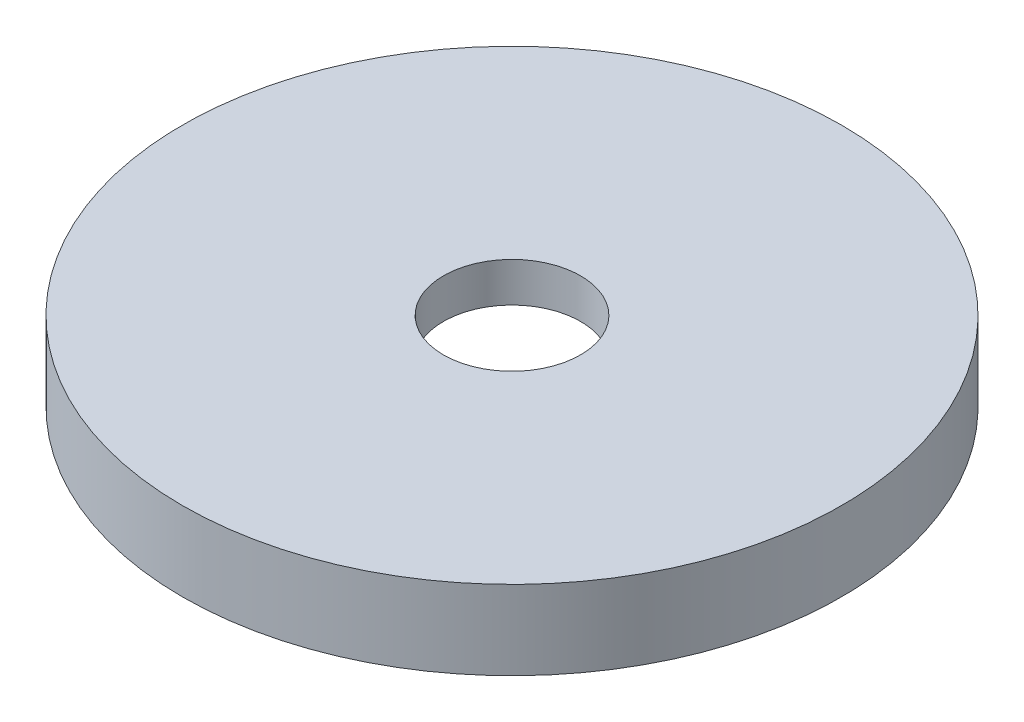
ISO-10303-21;
HEADER;
FILE_DESCRIPTION(('STEP AP214'),'2;1');
FILE_NAME('part.step','',(''),(''),'','','');
FILE_SCHEMA(('AUTOMOTIVE_DESIGN { 1 0 10303 214 1 1 1 1 }'));
ENDSEC;
DATA;
#1=APPLICATION_CONTEXT('core data for automotive mechanical design processes');
#2=APPLICATION_PROTOCOL_DEFINITION('international standard','automotive_design',2000,#1);
#3=PRODUCT_CONTEXT('',#1,'mechanical');
#4=PRODUCT('Part','Part','',(#3));
#5=PRODUCT_RELATED_PRODUCT_CATEGORY('part','',(#4));
#6=PRODUCT_DEFINITION_FORMATION('','',#4);
#7=PRODUCT_DEFINITION_CONTEXT('part definition',#1,'design');
#8=PRODUCT_DEFINITION('design','',#6,#7);
#9=PRODUCT_DEFINITION_SHAPE('','',#8);
#10=(LENGTH_UNIT() NAMED_UNIT(*) SI_UNIT(.MILLI.,.METRE.));
#11=(NAMED_UNIT(*) PLANE_ANGLE_UNIT() SI_UNIT($,.RADIAN.));
#12=(NAMED_UNIT(*) SI_UNIT($,.STERADIAN.) SOLID_ANGLE_UNIT());
#13=UNCERTAINTY_MEASURE_WITH_UNIT(LENGTH_MEASURE(1.E-05),#10,'distance_accuracy_value','');
#14=(GEOMETRIC_REPRESENTATION_CONTEXT(3) GLOBAL_UNCERTAINTY_ASSIGNED_CONTEXT((#13)) GLOBAL_UNIT_ASSIGNED_CONTEXT((#10,
#11,#12)) REPRESENTATION_CONTEXT('',''));
#15=CARTESIAN_POINT('',(0.,0.,0.));
#16=DIRECTION('',(0.,0.,1.));
#17=DIRECTION('',(1.,0.,0.));
#18=AXIS2_PLACEMENT_3D('',#15,#16,#17);
#19=CARTESIAN_POINT('',(0.,0.,0.));
#20=DIRECTION('',(0.,1.,0.));
#21=DIRECTION('',(0.,0.,1.));
#22=AXIS2_PLACEMENT_3D('',#19,#20,#21);
#23=PLANE('',#22);
#24=CARTESIAN_POINT('',(0.,0.,0.));
#25=DIRECTION('',(0.,1.,0.));
#26=DIRECTION('',(0.,0.,1.));
#27=AXIS2_PLACEMENT_3D('',#24,#25,#26);
#28=CIRCLE('',#27,12.5);
#29=CARTESIAN_POINT('',(0.,0.,12.5));
#30=VERTEX_POINT('',#29);
#31=EDGE_CURVE('E10',#30,#30,#28,.T.);
#32=ORIENTED_EDGE('',*,*,#31,.F.);
#33=EDGE_LOOP('',(#32));
#34=FACE_BOUND('',#33,.T.);
#35=CARTESIAN_POINT('',(0.,0.,0.));
#36=DIRECTION('',(0.,1.,0.));
#37=DIRECTION('',(0.,0.,1.));
#38=AXIS2_PLACEMENT_3D('',#35,#36,#37);
#39=CIRCLE('',#38,10.);
#40=CARTESIAN_POINT('',(0.,0.,10.));
#41=VERTEX_POINT('',#40);
#42=EDGE_CURVE('E44',#41,#41,#39,.T.);
#43=ORIENTED_EDGE('',*,*,#42,.T.);
#44=EDGE_LOOP('',(#43));
#45=FACE_BOUND('',#44,.T.);
#46=ADVANCED_FACE('F37',(#34,#45),#23,.F.);
#47=CARTESIAN_POINT('',(0.,1.5,0.));
#48=DIRECTION('',(0.,-1.,0.));
#49=DIRECTION('',(0.,0.,-1.));
#50=AXIS2_PLACEMENT_3D('',#47,#48,#49);
#51=CYLINDRICAL_SURFACE('',#50,12.5);
#52=ORIENTED_EDGE('',*,*,#31,.T.);
#53=EDGE_LOOP('',(#52));
#54=FACE_BOUND('',#53,.T.);
#55=CARTESIAN_POINT('',(0.,3.,0.));
#56=DIRECTION('',(0.,1.,0.));
#57=DIRECTION('',(0.,0.,1.));
#58=AXIS2_PLACEMENT_3D('',#55,#56,#57);
#59=CIRCLE('',#58,12.5);
#60=CARTESIAN_POINT('',(0.,3.,12.5));
#61=VERTEX_POINT('',#60);
#62=EDGE_CURVE('E52',#61,#61,#59,.T.);
#63=ORIENTED_EDGE('',*,*,#62,.F.);
#64=EDGE_LOOP('',(#63));
#65=FACE_BOUND('',#64,.T.);
#66=ADVANCED_FACE('F39',(#54,#65),#51,.T.);
#67=CARTESIAN_POINT('',(0.,1.5,0.));
#68=DIRECTION('',(0.,-1.,0.));
#69=DIRECTION('',(0.,0.,-1.));
#70=AXIS2_PLACEMENT_3D('',#67,#68,#69);
#71=CYLINDRICAL_SURFACE('',#70,10.);
#72=CARTESIAN_POINT('',(0.,1.5,0.));
#73=DIRECTION('',(0.,1.,0.));
#74=DIRECTION('',(0.,0.,1.));
#75=AXIS2_PLACEMENT_3D('',#72,#73,#74);
#76=CIRCLE('',#75,10.);
#77=CARTESIAN_POINT('',(0.,1.5,10.));
#78=VERTEX_POINT('',#77);
#79=EDGE_CURVE('E48',#78,#78,#76,.T.);
#80=ORIENTED_EDGE('',*,*,#79,.T.);
#81=EDGE_LOOP('',(#80));
#82=FACE_BOUND('',#81,.T.);
#83=ORIENTED_EDGE('',*,*,#42,.F.);
#84=EDGE_LOOP('',(#83));
#85=FACE_BOUND('',#84,.T.);
#86=ADVANCED_FACE('F75',(#82,#85),#71,.F.);
#87=CARTESIAN_POINT('',(0.,1.5,0.));
#88=DIRECTION('',(0.,1.,0.));
#89=DIRECTION('',(0.,0.,1.));
#90=AXIS2_PLACEMENT_3D('',#87,#88,#89);
#91=PLANE('',#90);
#92=CARTESIAN_POINT('',(0.,1.5,0.));
#93=DIRECTION('',(0.,1.,0.));
#94=DIRECTION('',(0.,0.,1.));
#95=AXIS2_PLACEMENT_3D('',#92,#93,#94);
#96=CIRCLE('',#95,2.6);
#97=CARTESIAN_POINT('',(0.,1.5,2.6));
#98=VERTEX_POINT('',#97);
#99=EDGE_CURVE('E57',#98,#98,#96,.T.);
#100=ORIENTED_EDGE('',*,*,#99,.T.);
#101=EDGE_LOOP('',(#100));
#102=FACE_BOUND('',#101,.T.);
#103=ORIENTED_EDGE('',*,*,#79,.F.);
#104=EDGE_LOOP('',(#103));
#105=FACE_BOUND('',#104,.T.);
#106=ADVANCED_FACE('F70',(#102,#105),#91,.F.);
#107=CARTESIAN_POINT('',(0.,3.,0.));
#108=DIRECTION('',(0.,1.,0.));
#109=DIRECTION('',(0.,0.,1.));
#110=AXIS2_PLACEMENT_3D('',#107,#108,#109);
#111=PLANE('',#110);
#112=CARTESIAN_POINT('',(0.,3.,0.));
#113=DIRECTION('',(0.,1.,0.));
#114=DIRECTION('',(0.,0.,1.));
#115=AXIS2_PLACEMENT_3D('',#112,#113,#114);
#116=CIRCLE('',#115,2.6);
#117=CARTESIAN_POINT('',(0.,3.,2.6));
#118=VERTEX_POINT('',#117);
#119=EDGE_CURVE('E60',#118,#118,#116,.T.);
#120=ORIENTED_EDGE('',*,*,#119,.F.);
#121=EDGE_LOOP('',(#120));
#122=FACE_BOUND('',#121,.T.);
#123=ORIENTED_EDGE('',*,*,#62,.T.);
#124=EDGE_LOOP('',(#123));
#125=FACE_BOUND('',#124,.T.);
#126=ADVANCED_FACE('F67',(#122,#125),#111,.T.);
#127=CARTESIAN_POINT('',(0.,1.,0.));
#128=DIRECTION('',(0.,1.,0.));
#129=DIRECTION('',(0.,0.,1.));
#130=AXIS2_PLACEMENT_3D('',#127,#128,#129);
#131=CYLINDRICAL_SURFACE('',#130,2.6);
#132=ORIENTED_EDGE('',*,*,#119,.T.);
#133=EDGE_LOOP('',(#132));
#134=FACE_BOUND('',#133,.T.);
#135=ORIENTED_EDGE('',*,*,#99,.F.);
#136=EDGE_LOOP('',(#135));
#137=FACE_BOUND('',#136,.T.);
#138=ADVANCED_FACE('F64',(#134,#137),#131,.F.);
#139=CLOSED_SHELL('',(#46,#66,#86,#106,#126,#138));
#140=MANIFOLD_SOLID_BREP('B2',#139);
#141=ADVANCED_BREP_SHAPE_REPRESENTATION('',(#18,#140),#14);
#142=SHAPE_DEFINITION_REPRESENTATION(#9,#141);
ENDSEC;
END-ISO-10303-21;
